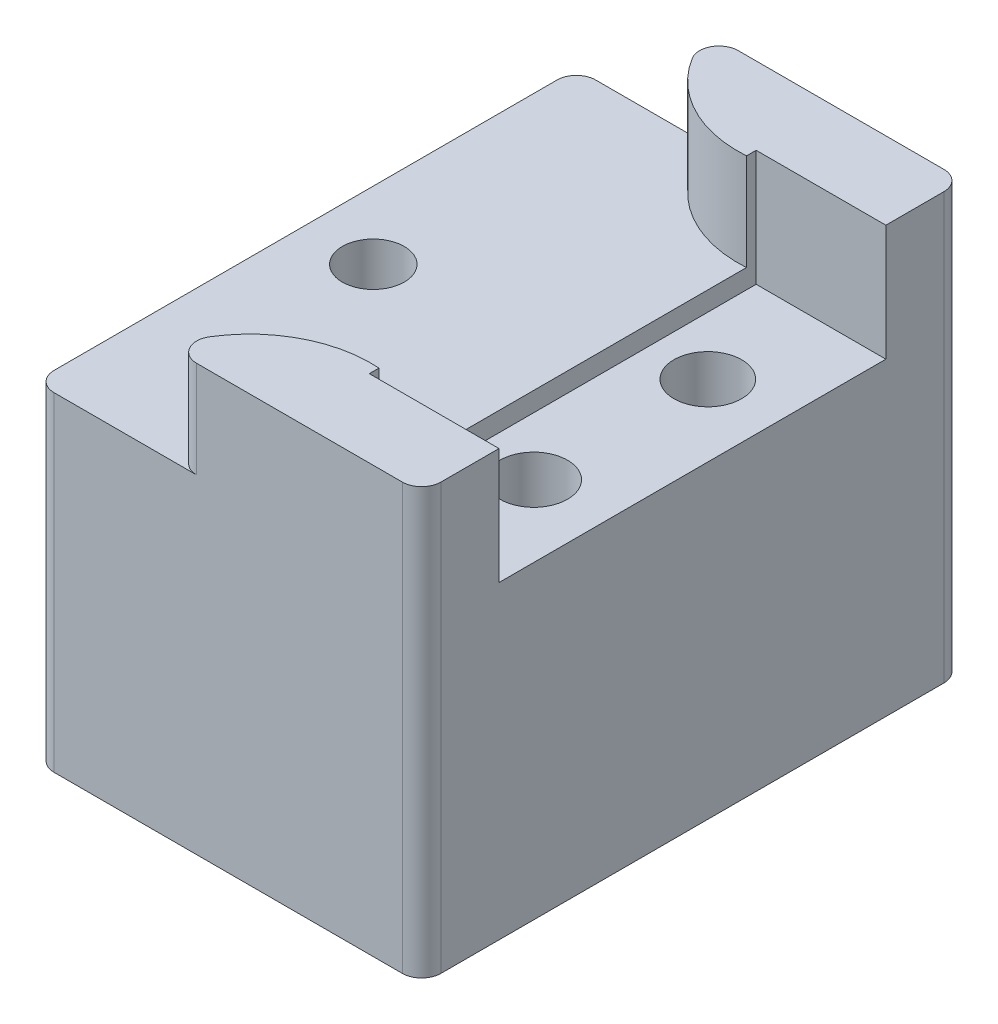
ISO-10303-21;
HEADER;
FILE_DESCRIPTION(('STEP AP214'),'2;1');
FILE_NAME('part.step','',(''),(''),'','','');
FILE_SCHEMA(('AUTOMOTIVE_DESIGN { 1 0 10303 214 1 1 1 1 }'));
ENDSEC;
DATA;
#1=APPLICATION_CONTEXT('core data for automotive mechanical design processes');
#2=APPLICATION_PROTOCOL_DEFINITION('international standard','automotive_design',2000,#1);
#3=PRODUCT_CONTEXT('',#1,'mechanical');
#4=PRODUCT('Part','Part','',(#3));
#5=PRODUCT_RELATED_PRODUCT_CATEGORY('part','',(#4));
#6=PRODUCT_DEFINITION_FORMATION('','',#4);
#7=PRODUCT_DEFINITION_CONTEXT('part definition',#1,'design');
#8=PRODUCT_DEFINITION('design','',#6,#7);
#9=PRODUCT_DEFINITION_SHAPE('','',#8);
#10=(LENGTH_UNIT() NAMED_UNIT(*) SI_UNIT(.MILLI.,.METRE.));
#11=(NAMED_UNIT(*) PLANE_ANGLE_UNIT() SI_UNIT($,.RADIAN.));
#12=(NAMED_UNIT(*) SI_UNIT($,.STERADIAN.) SOLID_ANGLE_UNIT());
#13=UNCERTAINTY_MEASURE_WITH_UNIT(LENGTH_MEASURE(1.E-05),#10,'distance_accuracy_value','');
#14=(GEOMETRIC_REPRESENTATION_CONTEXT(3) GLOBAL_UNCERTAINTY_ASSIGNED_CONTEXT((#13)) GLOBAL_UNIT_ASSIGNED_CONTEXT((#10,
#11,#12)) REPRESENTATION_CONTEXT('',''));
#15=CARTESIAN_POINT('',(0.,0.,0.));
#16=DIRECTION('',(0.,0.,1.));
#17=DIRECTION('',(1.,0.,0.));
#18=AXIS2_PLACEMENT_3D('',#15,#16,#17);
#19=CARTESIAN_POINT('',(-10.8433734939759,22.,-8.47389558232932));
#20=DIRECTION('',(1.,0.,0.));
#21=DIRECTION('',(0.,0.,-1.));
#22=AXIS2_PLACEMENT_3D('',#19,#20,#21);
#23=PLANE('',#22);
#24=DIRECTION('',(0.,0.,1.));
#25=VECTOR('',#24,1.);
#26=CARTESIAN_POINT('',(-10.8433734939759,17.,0.));
#27=LINE('',#26,#25);
#28=CARTESIAN_POINT('',(-10.8433734939759,17.,-7.47389558232932));
#29=VERTEX_POINT('',#28);
#30=CARTESIAN_POINT('',(-10.8433734939759,17.,18.5261044176707));
#31=VERTEX_POINT('',#30);
#32=EDGE_CURVE('E314',#29,#31,#27,.T.);
#33=ORIENTED_EDGE('',*,*,#32,.F.);
#34=DIRECTION('',(0.,-1.,0.));
#35=VECTOR('',#34,1.);
#36=CARTESIAN_POINT('',(-10.8433734939759,22.,-7.47389558232932));
#37=LINE('',#36,#35);
#38=CARTESIAN_POINT('',(-10.8433734939759,0.,-7.47389558232932));
#39=VERTEX_POINT('',#38);
#40=EDGE_CURVE('E284',#29,#39,#37,.T.);
#41=ORIENTED_EDGE('',*,*,#40,.T.);
#42=DIRECTION('',(0.,0.,1.));
#43=VECTOR('',#42,1.);
#44=CARTESIAN_POINT('',(-10.8433734939759,0.,-8.47389558232932));
#45=LINE('',#44,#43);
#46=CARTESIAN_POINT('',(-10.8433734939759,0.,18.5261044176707));
#47=VERTEX_POINT('',#46);
#48=EDGE_CURVE('E216',#39,#47,#45,.T.);
#49=ORIENTED_EDGE('',*,*,#48,.T.);
#50=DIRECTION('',(0.,-1.,0.));
#51=VECTOR('',#50,1.);
#52=CARTESIAN_POINT('',(-10.8433734939759,22.,18.5261044176707));
#53=LINE('',#52,#51);
#54=EDGE_CURVE('E48',#47,#31,#53,.F.);
#55=ORIENTED_EDGE('',*,*,#54,.T.);
#56=EDGE_LOOP('',(#33,#41,#49,#55));
#57=FACE_BOUND('',#56,.T.);
#58=ADVANCED_FACE('F33',(#57),#23,.F.);
#59=CARTESIAN_POINT('',(-10.8433734939759,22.,19.5261044176707));
#60=DIRECTION('',(0.,0.,-1.));
#61=DIRECTION('',(-1.,0.,0.));
#62=AXIS2_PLACEMENT_3D('',#59,#60,#61);
#63=PLANE('',#62);
#64=DIRECTION('',(1.,0.,0.));
#65=VECTOR('',#64,1.);
#66=CARTESIAN_POINT('',(-10.8433734939759,22.,19.5261044176707));
#67=LINE('',#66,#65);
#68=CARTESIAN_POINT('',(-2.47408756950972,22.,19.5261044176707));
#69=VERTEX_POINT('',#68);
#70=CARTESIAN_POINT('',(8.15662650602409,22.,19.5261044176707));
#71=VERTEX_POINT('',#70);
#72=EDGE_CURVE('E223',#69,#71,#67,.T.);
#73=ORIENTED_EDGE('',*,*,#72,.F.);
#74=DIRECTION('',(0.,-1.,0.));
#75=VECTOR('',#74,1.);
#76=CARTESIAN_POINT('',(-2.47408756950972,17.,19.5261044176707));
#77=LINE('',#76,#75);
#78=CARTESIAN_POINT('',(-2.47408756950972,17.,19.5261044176707));
#79=VERTEX_POINT('',#78);
#80=EDGE_CURVE('E267',#69,#79,#77,.T.);
#81=ORIENTED_EDGE('',*,*,#80,.T.);
#82=DIRECTION('',(1.,0.,0.));
#83=VECTOR('',#82,1.);
#84=CARTESIAN_POINT('',(0.,17.,19.5261044176707));
#85=LINE('',#84,#83);
#86=CARTESIAN_POINT('',(-9.8433734939759,17.,19.5261044176707));
#87=VERTEX_POINT('',#86);
#88=EDGE_CURVE('E190',#87,#79,#85,.T.);
#89=ORIENTED_EDGE('',*,*,#88,.F.);
#90=DIRECTION('',(0.,-1.,0.));
#91=VECTOR('',#90,1.);
#92=CARTESIAN_POINT('',(-9.8433734939759,22.,19.5261044176707));
#93=LINE('',#92,#91);
#94=CARTESIAN_POINT('',(-9.8433734939759,0.,19.5261044176707));
#95=VERTEX_POINT('',#94);
#96=EDGE_CURVE('E264',#87,#95,#93,.T.);
#97=ORIENTED_EDGE('',*,*,#96,.T.);
#98=DIRECTION('',(1.,0.,0.));
#99=VECTOR('',#98,1.);
#100=CARTESIAN_POINT('',(-10.8433734939759,0.,19.5261044176707));
#101=LINE('',#100,#99);
#102=CARTESIAN_POINT('',(8.15662650602409,0.,19.5261044176707));
#103=VERTEX_POINT('',#102);
#104=EDGE_CURVE('E235',#95,#103,#101,.T.);
#105=ORIENTED_EDGE('',*,*,#104,.T.);
#106=DIRECTION('',(0.,-1.,0.));
#107=VECTOR('',#106,1.);
#108=CARTESIAN_POINT('',(8.15662650602409,22.,19.5261044176707));
#109=LINE('',#108,#107);
#110=EDGE_CURVE('E262',#103,#71,#109,.F.);
#111=ORIENTED_EDGE('',*,*,#110,.T.);
#112=EDGE_LOOP('',(#73,#81,#89,#97,#105,#111));
#113=FACE_BOUND('',#112,.T.);
#114=ADVANCED_FACE('F345',(#113),#63,.F.);
#115=CARTESIAN_POINT('',(0.,22.,0.));
#116=DIRECTION('',(0.,1.,0.));
#117=DIRECTION('',(0.,0.,1.));
#118=AXIS2_PLACEMENT_3D('',#115,#116,#117);
#119=PLANE('',#118);
#120=CARTESIAN_POINT('',(2.02042580318858,22.,21.2850908464605));
#121=DIRECTION('',(0.,1.,0.));
#122=DIRECTION('',(0.,0.,1.));
#123=AXIS2_PLACEMENT_3D('',#120,#121,#122);
#124=CIRCLE('',#123,6.27377062182364);
#125=CARTESIAN_POINT('',(2.45087521889544,22.,15.0261044176707));
#126=VERTEX_POINT('',#125);
#127=CARTESIAN_POINT('',(-3.32632663999551,22.,18.0029518904499));
#128=VERTEX_POINT('',#127);
#129=EDGE_CURVE('E319',#126,#128,#124,.T.);
#130=ORIENTED_EDGE('',*,*,#129,.T.);
#131=CARTESIAN_POINT('',(-2.47408756950972,22.,18.5261044176707));
#132=DIRECTION('',(0.,1.,0.));
#133=DIRECTION('',(0.,0.,1.));
#134=AXIS2_PLACEMENT_3D('',#131,#132,#133);
#135=CIRCLE('',#134,1.);
#136=EDGE_CURVE('E260',#128,#69,#135,.T.);
#137=ORIENTED_EDGE('',*,*,#136,.T.);
#138=ORIENTED_EDGE('',*,*,#72,.T.);
#139=CARTESIAN_POINT('',(8.15662650602409,22.,18.5261044176707));
#140=DIRECTION('',(0.,1.,0.));
#141=DIRECTION('',(0.,0.,1.));
#142=AXIS2_PLACEMENT_3D('',#139,#140,#141);
#143=CIRCLE('',#142,1.);
#144=CARTESIAN_POINT('',(9.15662650602409,22.,18.5261044176707));
#145=VERTEX_POINT('',#144);
#146=EDGE_CURVE('E258',#71,#145,#143,.T.);
#147=ORIENTED_EDGE('',*,*,#146,.T.);
#148=DIRECTION('',(0.,0.,-1.));
#149=VECTOR('',#148,1.);
#150=CARTESIAN_POINT('',(9.15662650602409,22.,-8.47389558232932));
#151=LINE('',#150,#149);
#152=CARTESIAN_POINT('',(9.15662650602409,22.,15.5261044176707));
#153=VERTEX_POINT('',#152);
#154=EDGE_CURVE('E228',#145,#153,#151,.T.);
#155=ORIENTED_EDGE('',*,*,#154,.T.);
#156=DIRECTION('',(1.,0.,0.));
#157=VECTOR('',#156,1.);
#158=CARTESIAN_POINT('',(9.15662650602409,22.,15.5261044176707));
#159=LINE('',#158,#157);
#160=CARTESIAN_POINT('',(2.45087521889544,22.,15.5261044176707));
#161=VERTEX_POINT('',#160);
#162=EDGE_CURVE('E200',#161,#153,#159,.T.);
#163=ORIENTED_EDGE('',*,*,#162,.F.);
#164=DIRECTION('',(0.,0.,1.));
#165=VECTOR('',#164,1.);
#166=CARTESIAN_POINT('',(2.45087521889543,22.,-4.47389558232932));
#167=LINE('',#166,#165);
#168=EDGE_CURVE('E188',#126,#161,#167,.T.);
#169=ORIENTED_EDGE('',*,*,#168,.F.);
#170=EDGE_LOOP('',(#130,#137,#138,#147,#155,#163,#169));
#171=FACE_BOUND('',#170,.T.);
#172=ADVANCED_FACE('F342',(#171),#119,.T.);
#173=CARTESIAN_POINT('',(2.45087521889543,16.,-4.47389558232932));
#174=DIRECTION('',(-1.,0.,0.));
#175=DIRECTION('',(0.,0.,1.));
#176=AXIS2_PLACEMENT_3D('',#173,#174,#175);
#177=PLANE('',#176);
#178=DIRECTION('',(0.,1.,0.));
#179=VECTOR('',#178,1.);
#180=CARTESIAN_POINT('',(2.45087521889544,17.,15.0261044176707));
#181=LINE('',#180,#179);
#182=CARTESIAN_POINT('',(2.45087521889544,17.,15.0261044176707));
#183=VERTEX_POINT('',#182);
#184=EDGE_CURVE('E185',#183,#126,#181,.T.);
#185=ORIENTED_EDGE('',*,*,#184,.T.);
#186=ORIENTED_EDGE('',*,*,#168,.T.);
#187=DIRECTION('',(0.,1.,0.));
#188=VECTOR('',#187,1.);
#189=CARTESIAN_POINT('',(2.45087521889544,16.,15.5261044176707));
#190=LINE('',#189,#188);
#191=CARTESIAN_POINT('',(2.45087521889544,16.,15.5261044176707));
#192=VERTEX_POINT('',#191);
#193=EDGE_CURVE('E217',#192,#161,#190,.T.);
#194=ORIENTED_EDGE('',*,*,#193,.F.);
#195=DIRECTION('',(0.,0.,1.));
#196=VECTOR('',#195,1.);
#197=CARTESIAN_POINT('',(2.45087521889543,16.,-4.47389558232932));
#198=LINE('',#197,#196);
#199=CARTESIAN_POINT('',(2.45087521889543,16.,-4.47389558232932));
#200=VERTEX_POINT('',#199);
#201=EDGE_CURVE('E203',#200,#192,#198,.T.);
#202=ORIENTED_EDGE('',*,*,#201,.F.);
#203=DIRECTION('',(0.,1.,0.));
#204=VECTOR('',#203,1.);
#205=CARTESIAN_POINT('',(2.45087521889543,16.,-4.47389558232932));
#206=LINE('',#205,#204);
#207=CARTESIAN_POINT('',(2.45087521889543,22.,-4.47389558232932));
#208=VERTEX_POINT('',#207);
#209=EDGE_CURVE('E220',#200,#208,#206,.T.);
#210=ORIENTED_EDGE('',*,*,#209,.T.);
#211=CARTESIAN_POINT('',(2.45087521889543,22.,-3.97389558232932));
#212=VERTEX_POINT('',#211);
#213=EDGE_CURVE('E183',#208,#212,#167,.T.);
#214=ORIENTED_EDGE('',*,*,#213,.T.);
#215=DIRECTION('',(0.,1.,0.));
#216=VECTOR('',#215,1.);
#217=CARTESIAN_POINT('',(2.45087521889543,17.,-3.97389558232932));
#218=LINE('',#217,#216);
#219=CARTESIAN_POINT('',(2.45087521889543,17.,-3.97389558232932));
#220=VERTEX_POINT('',#219);
#221=EDGE_CURVE('E163',#220,#212,#218,.T.);
#222=ORIENTED_EDGE('',*,*,#221,.F.);
#223=DIRECTION('',(0.,0.,-1.));
#224=VECTOR('',#223,1.);
#225=CARTESIAN_POINT('',(2.45087521889543,17.,0.));
#226=LINE('',#225,#224);
#227=EDGE_CURVE('E170',#183,#220,#226,.T.);
#228=ORIENTED_EDGE('',*,*,#227,.F.);
#229=EDGE_LOOP('',(#185,#186,#194,#202,#210,#214,#222,#228));
#230=FACE_BOUND('',#229,.T.);
#231=ADVANCED_FACE('F181',(#230),#177,.F.);
#232=CARTESIAN_POINT('',(9.15662650602409,22.,-8.47389558232932));
#233=DIRECTION('',(-1.,0.,0.));
#234=DIRECTION('',(0.,0.,1.));
#235=AXIS2_PLACEMENT_3D('',#232,#233,#234);
#236=PLANE('',#235);
#237=DIRECTION('',(0.,0.,-1.));
#238=VECTOR('',#237,1.);
#239=CARTESIAN_POINT('',(9.15662650602409,0.,-8.47389558232932));
#240=LINE('',#239,#238);
#241=CARTESIAN_POINT('',(9.15662650602409,0.,18.5261044176707));
#242=VERTEX_POINT('',#241);
#243=CARTESIAN_POINT('',(9.15662650602409,0.,-7.47389558232932));
#244=VERTEX_POINT('',#243);
#245=EDGE_CURVE('E238',#242,#244,#240,.T.);
#246=ORIENTED_EDGE('',*,*,#245,.T.);
#247=DIRECTION('',(0.,-1.,0.));
#248=VECTOR('',#247,1.);
#249=CARTESIAN_POINT('',(9.15662650602409,22.,-7.47389558232932));
#250=LINE('',#249,#248);
#251=CARTESIAN_POINT('',(9.15662650602409,22.,-7.47389558232932));
#252=VERTEX_POINT('',#251);
#253=EDGE_CURVE('E281',#244,#252,#250,.F.);
#254=ORIENTED_EDGE('',*,*,#253,.T.);
#255=CARTESIAN_POINT('',(9.15662650602409,22.,-4.47389558232932));
#256=VERTEX_POINT('',#255);
#257=EDGE_CURVE('E226',#256,#252,#151,.T.);
#258=ORIENTED_EDGE('',*,*,#257,.F.);
#259=DIRECTION('',(0.,1.,0.));
#260=VECTOR('',#259,1.);
#261=CARTESIAN_POINT('',(9.15662650602409,16.,-4.47389558232932));
#262=LINE('',#261,#260);
#263=CARTESIAN_POINT('',(9.15662650602409,16.,-4.47389558232932));
#264=VERTEX_POINT('',#263);
#265=EDGE_CURVE('E208',#264,#256,#262,.T.);
#266=ORIENTED_EDGE('',*,*,#265,.F.);
#267=DIRECTION('',(0.,0.,-1.));
#268=VECTOR('',#267,1.);
#269=CARTESIAN_POINT('',(9.15662650602409,16.,-4.47389558232932));
#270=LINE('',#269,#268);
#271=CARTESIAN_POINT('',(9.15662650602409,16.,15.5261044176707));
#272=VERTEX_POINT('',#271);
#273=EDGE_CURVE('E196',#272,#264,#270,.T.);
#274=ORIENTED_EDGE('',*,*,#273,.F.);
#275=DIRECTION('',(0.,1.,0.));
#276=VECTOR('',#275,1.);
#277=CARTESIAN_POINT('',(9.15662650602409,16.,15.5261044176707));
#278=LINE('',#277,#276);
#279=EDGE_CURVE('E213',#272,#153,#278,.T.);
#280=ORIENTED_EDGE('',*,*,#279,.T.);
#281=ORIENTED_EDGE('',*,*,#154,.F.);
#282=DIRECTION('',(0.,-1.,0.));
#283=VECTOR('',#282,1.);
#284=CARTESIAN_POINT('',(9.15662650602409,22.,18.5261044176707));
#285=LINE('',#284,#283);
#286=EDGE_CURVE('E278',#145,#242,#285,.T.);
#287=ORIENTED_EDGE('',*,*,#286,.T.);
#288=EDGE_LOOP('',(#246,#254,#258,#266,#274,#280,#281,#287));
#289=FACE_BOUND('',#288,.T.);
#290=ADVANCED_FACE('F354',(#289),#236,.F.);
#291=CARTESIAN_POINT('',(-10.8433734939759,22.,-8.47389558232932));
#292=DIRECTION('',(0.,0.,1.));
#293=DIRECTION('',(1.,0.,0.));
#294=AXIS2_PLACEMENT_3D('',#291,#292,#293);
#295=PLANE('',#294);
#296=DIRECTION('',(-1.,0.,0.));
#297=VECTOR('',#296,1.);
#298=CARTESIAN_POINT('',(0.,17.,-8.47389558232932));
#299=LINE('',#298,#297);
#300=CARTESIAN_POINT('',(-2.47408756950971,17.,-8.47389558232932));
#301=VERTEX_POINT('',#300);
#302=CARTESIAN_POINT('',(-9.84337349397591,17.,-8.47389558232932));
#303=VERTEX_POINT('',#302);
#304=EDGE_CURVE('E169',#301,#303,#299,.T.);
#305=ORIENTED_EDGE('',*,*,#304,.F.);
#306=DIRECTION('',(0.,1.,0.));
#307=VECTOR('',#306,1.);
#308=CARTESIAN_POINT('',(-2.47408756950971,22.,-8.47389558232932));
#309=LINE('',#308,#307);
#310=CARTESIAN_POINT('',(-2.47408756950971,22.,-8.47389558232932));
#311=VERTEX_POINT('',#310);
#312=EDGE_CURVE('E247',#301,#311,#309,.T.);
#313=ORIENTED_EDGE('',*,*,#312,.T.);
#314=DIRECTION('',(-1.,0.,0.));
#315=VECTOR('',#314,1.);
#316=CARTESIAN_POINT('',(-10.8433734939759,22.,-8.47389558232932));
#317=LINE('',#316,#315);
#318=CARTESIAN_POINT('',(8.15662650602409,22.,-8.47389558232932));
#319=VERTEX_POINT('',#318);
#320=EDGE_CURVE('E230',#319,#311,#317,.T.);
#321=ORIENTED_EDGE('',*,*,#320,.F.);
#322=DIRECTION('',(0.,-1.,0.));
#323=VECTOR('',#322,1.);
#324=CARTESIAN_POINT('',(8.15662650602409,22.,-8.47389558232932));
#325=LINE('',#324,#323);
#326=CARTESIAN_POINT('',(8.15662650602409,0.,-8.47389558232932));
#327=VERTEX_POINT('',#326);
#328=EDGE_CURVE('E244',#319,#327,#325,.T.);
#329=ORIENTED_EDGE('',*,*,#328,.T.);
#330=DIRECTION('',(-1.,0.,0.));
#331=VECTOR('',#330,1.);
#332=CARTESIAN_POINT('',(-10.8433734939759,0.,-8.47389558232932));
#333=LINE('',#332,#331);
#334=CARTESIAN_POINT('',(-9.84337349397591,0.,-8.47389558232932));
#335=VERTEX_POINT('',#334);
#336=EDGE_CURVE('E227',#327,#335,#333,.T.);
#337=ORIENTED_EDGE('',*,*,#336,.T.);
#338=DIRECTION('',(0.,-1.,0.));
#339=VECTOR('',#338,1.);
#340=CARTESIAN_POINT('',(-9.84337349397591,22.,-8.47389558232932));
#341=LINE('',#340,#339);
#342=EDGE_CURVE('E233',#335,#303,#341,.F.);
#343=ORIENTED_EDGE('',*,*,#342,.T.);
#344=EDGE_LOOP('',(#305,#313,#321,#329,#337,#343));
#345=FACE_BOUND('',#344,.T.);
#346=ADVANCED_FACE('F294',(#345),#295,.F.);
#347=ORIENTED_EDGE('',*,*,#320,.T.);
#348=CARTESIAN_POINT('',(-2.47408756950971,22.,-7.47389558232932));
#349=DIRECTION('',(0.,1.,0.));
#350=DIRECTION('',(0.,0.,1.));
#351=AXIS2_PLACEMENT_3D('',#348,#349,#350);
#352=CIRCLE('',#351,1.);
#353=CARTESIAN_POINT('',(-3.32632663999551,22.,-6.95074305510852));
#354=VERTEX_POINT('',#353);
#355=EDGE_CURVE('E252',#311,#354,#352,.T.);
#356=ORIENTED_EDGE('',*,*,#355,.T.);
#357=CARTESIAN_POINT('',(2.02042580318858,22.,-10.2328820111191));
#358=DIRECTION('',(0.,1.,0.));
#359=DIRECTION('',(0.,0.,1.));
#360=AXIS2_PLACEMENT_3D('',#357,#358,#359);
#361=CIRCLE('',#360,6.27377062182364);
#362=EDGE_CURVE('E193',#212,#354,#361,.F.);
#363=ORIENTED_EDGE('',*,*,#362,.F.);
#364=ORIENTED_EDGE('',*,*,#213,.F.);
#365=DIRECTION('',(-1.,0.,0.));
#366=VECTOR('',#365,1.);
#367=CARTESIAN_POINT('',(9.15662650602409,22.,-4.47389558232932));
#368=LINE('',#367,#366);
#369=EDGE_CURVE('E184',#256,#208,#368,.T.);
#370=ORIENTED_EDGE('',*,*,#369,.F.);
#371=ORIENTED_EDGE('',*,*,#257,.T.);
#372=CARTESIAN_POINT('',(8.15662650602409,22.,-7.47389558232932));
#373=DIRECTION('',(0.,1.,0.));
#374=DIRECTION('',(0.,0.,1.));
#375=AXIS2_PLACEMENT_3D('',#372,#373,#374);
#376=CIRCLE('',#375,1.);
#377=EDGE_CURVE('E250',#252,#319,#376,.T.);
#378=ORIENTED_EDGE('',*,*,#377,.T.);
#379=EDGE_LOOP('',(#347,#356,#363,#364,#370,#371,#378));
#380=FACE_BOUND('',#379,.T.);
#381=ADVANCED_FACE('F297',(#380),#119,.T.);
#382=CARTESIAN_POINT('',(0.,0.,0.));
#383=DIRECTION('',(0.,1.,0.));
#384=DIRECTION('',(0.,0.,1.));
#385=AXIS2_PLACEMENT_3D('',#382,#383,#384);
#386=PLANE('',#385);
#387=CARTESIAN_POINT('',(5.45087521889543,0.,10.0261044176707));
#388=DIRECTION('',(0.,1.,0.));
#389=DIRECTION('',(0.,0.,1.));
#390=AXIS2_PLACEMENT_3D('',#387,#388,#389);
#391=CIRCLE('',#390,1.75);
#392=CARTESIAN_POINT('',(5.45087521889543,0.,11.7761044176707));
#393=VERTEX_POINT('',#392);
#394=EDGE_CURVE('E563',#393,#393,#391,.T.);
#395=ORIENTED_EDGE('',*,*,#394,.T.);
#396=EDGE_LOOP('',(#395));
#397=FACE_BOUND('',#396,.T.);
#398=CARTESIAN_POINT('',(5.45087521889543,0.,1.02610441767068));
#399=DIRECTION('',(0.,1.,0.));
#400=DIRECTION('',(0.,0.,1.));
#401=AXIS2_PLACEMENT_3D('',#398,#399,#400);
#402=CIRCLE('',#401,1.75);
#403=CARTESIAN_POINT('',(5.45087521889543,0.,2.77610441767068));
#404=VERTEX_POINT('',#403);
#405=EDGE_CURVE('E330',#404,#404,#402,.T.);
#406=ORIENTED_EDGE('',*,*,#405,.T.);
#407=EDGE_LOOP('',(#406));
#408=FACE_BOUND('',#407,.T.);
#409=CARTESIAN_POINT('',(-7.34337349397591,0.,5.52610441767068));
#410=DIRECTION('',(0.,1.,0.));
#411=DIRECTION('',(0.,0.,1.));
#412=AXIS2_PLACEMENT_3D('',#409,#410,#411);
#413=CIRCLE('',#412,1.6);
#414=CARTESIAN_POINT('',(-7.34337349397591,0.,7.12610441767068));
#415=VERTEX_POINT('',#414);
#416=EDGE_CURVE('E321',#415,#415,#413,.T.);
#417=ORIENTED_EDGE('',*,*,#416,.T.);
#418=EDGE_LOOP('',(#417));
#419=FACE_BOUND('',#418,.T.);
#420=ORIENTED_EDGE('',*,*,#336,.F.);
#421=CARTESIAN_POINT('',(8.15662650602409,0.,-7.47389558232932));
#422=DIRECTION('',(0.,1.,0.));
#423=DIRECTION('',(0.,0.,1.));
#424=AXIS2_PLACEMENT_3D('',#421,#422,#423);
#425=CIRCLE('',#424,1.);
#426=EDGE_CURVE('E276',#327,#244,#425,.F.);
#427=ORIENTED_EDGE('',*,*,#426,.T.);
#428=ORIENTED_EDGE('',*,*,#245,.F.);
#429=CARTESIAN_POINT('',(8.15662650602409,0.,18.5261044176707));
#430=DIRECTION('',(0.,1.,0.));
#431=DIRECTION('',(0.,0.,1.));
#432=AXIS2_PLACEMENT_3D('',#429,#430,#431);
#433=CIRCLE('',#432,1.);
#434=EDGE_CURVE('E270',#242,#103,#433,.F.);
#435=ORIENTED_EDGE('',*,*,#434,.T.);
#436=ORIENTED_EDGE('',*,*,#104,.F.);
#437=CARTESIAN_POINT('',(-9.8433734939759,0.,18.5261044176707));
#438=DIRECTION('',(0.,1.,0.));
#439=DIRECTION('',(0.,0.,1.));
#440=AXIS2_PLACEMENT_3D('',#437,#438,#439);
#441=CIRCLE('',#440,1.);
#442=EDGE_CURVE('E272',#95,#47,#441,.F.);
#443=ORIENTED_EDGE('',*,*,#442,.T.);
#444=ORIENTED_EDGE('',*,*,#48,.F.);
#445=CARTESIAN_POINT('',(-9.84337349397591,0.,-7.47389558232932));
#446=DIRECTION('',(0.,1.,0.));
#447=DIRECTION('',(0.,0.,1.));
#448=AXIS2_PLACEMENT_3D('',#445,#446,#447);
#449=CIRCLE('',#448,1.);
#450=EDGE_CURVE('E274',#39,#335,#449,.F.);
#451=ORIENTED_EDGE('',*,*,#450,.T.);
#452=EDGE_LOOP('',(#420,#427,#428,#435,#436,#443,#444,#451));
#453=FACE_BOUND('',#452,.T.);
#454=ADVANCED_FACE('F308',(#397,#408,#419,#453),#386,.F.);
#455=CARTESIAN_POINT('',(9.15662650602409,16.,15.5261044176707));
#456=DIRECTION('',(0.,0.,1.));
#457=DIRECTION('',(1.,0.,0.));
#458=AXIS2_PLACEMENT_3D('',#455,#456,#457);
#459=PLANE('',#458);
#460=ORIENTED_EDGE('',*,*,#162,.T.);
#461=ORIENTED_EDGE('',*,*,#279,.F.);
#462=DIRECTION('',(1.,0.,0.));
#463=VECTOR('',#462,1.);
#464=CARTESIAN_POINT('',(9.15662650602409,16.,15.5261044176707));
#465=LINE('',#464,#463);
#466=EDGE_CURVE('E206',#192,#272,#465,.T.);
#467=ORIENTED_EDGE('',*,*,#466,.F.);
#468=ORIENTED_EDGE('',*,*,#193,.T.);
#469=EDGE_LOOP('',(#460,#461,#467,#468));
#470=FACE_BOUND('',#469,.T.);
#471=ADVANCED_FACE('F359',(#470),#459,.F.);
#472=CARTESIAN_POINT('',(9.15662650602409,16.,-4.47389558232932));
#473=DIRECTION('',(0.,0.,-1.));
#474=DIRECTION('',(-1.,0.,0.));
#475=AXIS2_PLACEMENT_3D('',#472,#473,#474);
#476=PLANE('',#475);
#477=ORIENTED_EDGE('',*,*,#369,.T.);
#478=ORIENTED_EDGE('',*,*,#209,.F.);
#479=DIRECTION('',(-1.,0.,0.));
#480=VECTOR('',#479,1.);
#481=CARTESIAN_POINT('',(9.15662650602409,16.,-4.47389558232932));
#482=LINE('',#481,#480);
#483=EDGE_CURVE('E199',#264,#200,#482,.T.);
#484=ORIENTED_EDGE('',*,*,#483,.F.);
#485=ORIENTED_EDGE('',*,*,#265,.T.);
#486=EDGE_LOOP('',(#477,#478,#484,#485));
#487=FACE_BOUND('',#486,.T.);
#488=ADVANCED_FACE('F364',(#487),#476,.F.);
#489=CARTESIAN_POINT('',(0.,16.,0.));
#490=DIRECTION('',(0.,-1.,0.));
#491=DIRECTION('',(0.,0.,-1.));
#492=AXIS2_PLACEMENT_3D('',#489,#490,#491);
#493=PLANE('',#492);
#494=CARTESIAN_POINT('',(5.45087521889543,16.,10.0261044176707));
#495=DIRECTION('',(0.,1.,0.));
#496=DIRECTION('',(0.,0.,1.));
#497=AXIS2_PLACEMENT_3D('',#494,#495,#496);
#498=CIRCLE('',#497,1.75);
#499=CARTESIAN_POINT('',(5.45087521889543,16.,11.7761044176707));
#500=VERTEX_POINT('',#499);
#501=EDGE_CURVE('E566',#500,#500,#498,.T.);
#502=ORIENTED_EDGE('',*,*,#501,.F.);
#503=EDGE_LOOP('',(#502));
#504=FACE_BOUND('',#503,.T.);
#505=CARTESIAN_POINT('',(5.45087521889543,16.,1.02610441767068));
#506=DIRECTION('',(0.,1.,0.));
#507=DIRECTION('',(0.,0.,1.));
#508=AXIS2_PLACEMENT_3D('',#505,#506,#507);
#509=CIRCLE('',#508,1.75);
#510=CARTESIAN_POINT('',(5.45087521889543,16.,2.77610441767068));
#511=VERTEX_POINT('',#510);
#512=EDGE_CURVE('E568',#511,#511,#509,.T.);
#513=ORIENTED_EDGE('',*,*,#512,.F.);
#514=EDGE_LOOP('',(#513));
#515=FACE_BOUND('',#514,.T.);
#516=ORIENTED_EDGE('',*,*,#273,.T.);
#517=ORIENTED_EDGE('',*,*,#483,.T.);
#518=ORIENTED_EDGE('',*,*,#201,.T.);
#519=ORIENTED_EDGE('',*,*,#466,.T.);
#520=EDGE_LOOP('',(#516,#517,#518,#519));
#521=FACE_BOUND('',#520,.T.);
#522=ADVANCED_FACE('F361',(#504,#515,#521),#493,.F.);
#523=CARTESIAN_POINT('',(2.02042580318858,17.,21.2850908464605));
#524=DIRECTION('',(0.,1.,0.));
#525=DIRECTION('',(0.,0.,1.));
#526=AXIS2_PLACEMENT_3D('',#523,#524,#525);
#527=CYLINDRICAL_SURFACE('',#526,6.27377062182364);
#528=CARTESIAN_POINT('',(2.02042580318858,17.,21.2850908464605));
#529=DIRECTION('',(0.,1.,0.));
#530=DIRECTION('',(0.,0.,1.));
#531=AXIS2_PLACEMENT_3D('',#528,#529,#530);
#532=CIRCLE('',#531,6.27377062182364);
#533=CARTESIAN_POINT('',(-3.32632663999551,17.,18.0029518904499));
#534=VERTEX_POINT('',#533);
#535=EDGE_CURVE('E175',#183,#534,#532,.T.);
#536=ORIENTED_EDGE('',*,*,#535,.T.);
#537=DIRECTION('',(0.,1.,0.));
#538=VECTOR('',#537,1.);
#539=CARTESIAN_POINT('',(-3.32632663999551,17.,18.0029518904499));
#540=LINE('',#539,#538);
#541=EDGE_CURVE('E255',#534,#128,#540,.T.);
#542=ORIENTED_EDGE('',*,*,#541,.T.);
#543=ORIENTED_EDGE('',*,*,#129,.F.);
#544=ORIENTED_EDGE('',*,*,#184,.F.);
#545=EDGE_LOOP('',(#536,#542,#543,#544));
#546=FACE_BOUND('',#545,.T.);
#547=ADVANCED_FACE('F336',(#546),#527,.T.);
#548=CARTESIAN_POINT('',(2.02042580318858,17.,-10.2328820111191));
#549=DIRECTION('',(0.,1.,0.));
#550=DIRECTION('',(0.,0.,1.));
#551=AXIS2_PLACEMENT_3D('',#548,#549,#550);
#552=CYLINDRICAL_SURFACE('',#551,6.27377062182364);
#553=ORIENTED_EDGE('',*,*,#362,.T.);
#554=DIRECTION('',(0.,1.,0.));
#555=VECTOR('',#554,1.);
#556=CARTESIAN_POINT('',(-3.32632663999551,17.,-6.95074305510852));
#557=LINE('',#556,#555);
#558=CARTESIAN_POINT('',(-3.32632663999551,17.,-6.95074305510852));
#559=VERTEX_POINT('',#558);
#560=EDGE_CURVE('E166',#354,#559,#557,.F.);
#561=ORIENTED_EDGE('',*,*,#560,.T.);
#562=CARTESIAN_POINT('',(2.02042580318858,17.,-10.2328820111191));
#563=DIRECTION('',(0.,1.,0.));
#564=DIRECTION('',(0.,0.,1.));
#565=AXIS2_PLACEMENT_3D('',#562,#563,#564);
#566=CIRCLE('',#565,6.27377062182364);
#567=EDGE_CURVE('E158',#220,#559,#566,.F.);
#568=ORIENTED_EDGE('',*,*,#567,.F.);
#569=ORIENTED_EDGE('',*,*,#221,.T.);
#570=EDGE_LOOP('',(#553,#561,#568,#569));
#571=FACE_BOUND('',#570,.T.);
#572=ADVANCED_FACE('F161',(#571),#552,.T.);
#573=CARTESIAN_POINT('',(0.,17.,0.));
#574=DIRECTION('',(0.,1.,0.));
#575=DIRECTION('',(0.,0.,1.));
#576=AXIS2_PLACEMENT_3D('',#573,#574,#575);
#577=PLANE('',#576);
#578=CARTESIAN_POINT('',(-7.34337349397591,17.,5.52610441767068));
#579=DIRECTION('',(0.,1.,0.));
#580=DIRECTION('',(0.,0.,1.));
#581=AXIS2_PLACEMENT_3D('',#578,#579,#580);
#582=CIRCLE('',#581,1.6);
#583=CARTESIAN_POINT('',(-7.34337349397591,17.,7.12610441767068));
#584=VERTEX_POINT('',#583);
#585=EDGE_CURVE('E325',#584,#584,#582,.T.);
#586=ORIENTED_EDGE('',*,*,#585,.F.);
#587=EDGE_LOOP('',(#586));
#588=FACE_BOUND('',#587,.T.);
#589=ORIENTED_EDGE('',*,*,#304,.T.);
#590=CARTESIAN_POINT('',(-9.84337349397591,17.,-7.47389558232932));
#591=DIRECTION('',(0.,1.,0.));
#592=DIRECTION('',(0.,0.,1.));
#593=AXIS2_PLACEMENT_3D('',#590,#591,#592);
#594=CIRCLE('',#593,1.);
#595=EDGE_CURVE('E55',#303,#29,#594,.T.);
#596=ORIENTED_EDGE('',*,*,#595,.T.);
#597=ORIENTED_EDGE('',*,*,#32,.T.);
#598=CARTESIAN_POINT('',(-9.8433734939759,17.,18.5261044176707));
#599=DIRECTION('',(0.,1.,0.));
#600=DIRECTION('',(0.,0.,1.));
#601=AXIS2_PLACEMENT_3D('',#598,#599,#600);
#602=CIRCLE('',#601,1.);
#603=EDGE_CURVE('E287',#31,#87,#602,.T.);
#604=ORIENTED_EDGE('',*,*,#603,.T.);
#605=ORIENTED_EDGE('',*,*,#88,.T.);
#606=CARTESIAN_POINT('',(-2.47408756950972,17.,18.5261044176707));
#607=DIRECTION('',(0.,1.,0.));
#608=DIRECTION('',(0.,0.,1.));
#609=AXIS2_PLACEMENT_3D('',#606,#607,#608);
#610=CIRCLE('',#609,1.);
#611=EDGE_CURVE('E11',#79,#534,#610,.F.);
#612=ORIENTED_EDGE('',*,*,#611,.T.);
#613=ORIENTED_EDGE('',*,*,#535,.F.);
#614=ORIENTED_EDGE('',*,*,#227,.T.);
#615=ORIENTED_EDGE('',*,*,#567,.T.);
#616=CARTESIAN_POINT('',(-2.47408756950971,17.,-7.47389558232932));
#617=DIRECTION('',(0.,1.,0.));
#618=DIRECTION('',(0.,0.,1.));
#619=AXIS2_PLACEMENT_3D('',#616,#617,#618);
#620=CIRCLE('',#619,1.);
#621=EDGE_CURVE('E41',#559,#301,#620,.F.);
#622=ORIENTED_EDGE('',*,*,#621,.T.);
#623=EDGE_LOOP('',(#589,#596,#597,#604,#605,#612,#613,#614,#615,#622));
#624=FACE_BOUND('',#623,.T.);
#625=ADVANCED_FACE('F173',(#588,#624),#577,.T.);
#626=CARTESIAN_POINT('',(-7.34337349397591,-6.67840441925287,5.52610441767068));
#627=DIRECTION('',(0.,1.,0.));
#628=DIRECTION('',(0.,0.,1.));
#629=AXIS2_PLACEMENT_3D('',#626,#627,#628);
#630=CYLINDRICAL_SURFACE('',#629,1.6);
#631=CARTESIAN_POINT('',(-7.34337349397591,17.,7.12610441767068));
#632=CARTESIAN_POINT('',(-7.34337349397591,16.8229166666667,7.12610441767068));
#633=CARTESIAN_POINT('',(-7.34337349397591,16.6458333333333,7.12610441767068));
#634=CARTESIAN_POINT('',(-7.34337349397591,16.2916666666667,7.12610441767068));
#635=CARTESIAN_POINT('',(-7.34337349397591,16.1145833333333,7.12610441767068));
#636=CARTESIAN_POINT('',(-7.34337349397591,15.7604166666667,7.12610441767068));
#637=CARTESIAN_POINT('',(-7.34337349397591,15.5833333333333,7.12610441767068));
#638=CARTESIAN_POINT('',(-7.34337349397591,15.2291666666667,7.12610441767068));
#639=CARTESIAN_POINT('',(-7.34337349397591,15.0520833333333,7.12610441767068));
#640=CARTESIAN_POINT('',(-7.34337349397591,14.6979166666667,7.12610441767068));
#641=CARTESIAN_POINT('',(-7.34337349397591,14.5208333333333,7.12610441767068));
#642=CARTESIAN_POINT('',(-7.34337349397591,14.1666666666667,7.12610441767068));
#643=CARTESIAN_POINT('',(-7.34337349397591,13.9895833333333,7.12610441767068));
#644=CARTESIAN_POINT('',(-7.34337349397591,13.6354166666667,7.12610441767068));
#645=CARTESIAN_POINT('',(-7.34337349397591,13.4583333333333,7.12610441767068));
#646=CARTESIAN_POINT('',(-7.34337349397591,13.1041666666667,7.12610441767068));
#647=CARTESIAN_POINT('',(-7.34337349397591,12.9270833333333,7.12610441767068));
#648=CARTESIAN_POINT('',(-7.34337349397591,12.5729166666667,7.12610441767068));
#649=CARTESIAN_POINT('',(-7.34337349397591,12.3958333333333,7.12610441767068));
#650=CARTESIAN_POINT('',(-7.34337349397591,12.0416666666667,7.12610441767068));
#651=CARTESIAN_POINT('',(-7.34337349397591,11.8645833333333,7.12610441767068));
#652=CARTESIAN_POINT('',(-7.34337349397591,11.5104166666667,7.12610441767068));
#653=CARTESIAN_POINT('',(-7.34337349397591,11.3333333333333,7.12610441767068));
#654=CARTESIAN_POINT('',(-7.34337349397591,10.9791666666667,7.12610441767068));
#655=CARTESIAN_POINT('',(-7.34337349397591,10.8020833333333,7.12610441767068));
#656=CARTESIAN_POINT('',(-7.34337349397591,10.4479166666667,7.12610441767068));
#657=CARTESIAN_POINT('',(-7.34337349397591,10.2708333333333,7.12610441767068));
#658=CARTESIAN_POINT('',(-7.34337349397591,9.91666666666666,7.12610441767068));
#659=CARTESIAN_POINT('',(-7.34337349397591,9.73958333333333,7.12610441767068));
#660=CARTESIAN_POINT('',(-7.34337349397591,9.38541666666666,7.12610441767068));
#661=CARTESIAN_POINT('',(-7.34337349397591,9.20833333333333,7.12610441767068));
#662=CARTESIAN_POINT('',(-7.34337349397591,8.85416666666666,7.12610441767068));
#663=CARTESIAN_POINT('',(-7.34337349397591,8.67708333333333,7.12610441767068));
#664=CARTESIAN_POINT('',(-7.34337349397591,8.32291666666666,7.12610441767068));
#665=CARTESIAN_POINT('',(-7.34337349397591,8.14583333333333,7.12610441767068));
#666=CARTESIAN_POINT('',(-7.34337349397591,7.79166666666666,7.12610441767068));
#667=CARTESIAN_POINT('',(-7.34337349397591,7.61458333333333,7.12610441767068));
#668=CARTESIAN_POINT('',(-7.34337349397591,7.26041666666666,7.12610441767068));
#669=CARTESIAN_POINT('',(-7.34337349397591,7.08333333333333,7.12610441767068));
#670=CARTESIAN_POINT('',(-7.34337349397591,6.72916666666666,7.12610441767068));
#671=CARTESIAN_POINT('',(-7.34337349397591,6.55208333333333,7.12610441767068));
#672=CARTESIAN_POINT('',(-7.34337349397591,6.19791666666666,7.12610441767068));
#673=CARTESIAN_POINT('',(-7.34337349397591,6.02083333333333,7.12610441767068));
#674=CARTESIAN_POINT('',(-7.34337349397591,5.66666666666666,7.12610441767068));
#675=CARTESIAN_POINT('',(-7.34337349397591,5.48958333333333,7.12610441767068));
#676=CARTESIAN_POINT('',(-7.34337349397591,5.13541666666666,7.12610441767068));
#677=CARTESIAN_POINT('',(-7.34337349397591,4.95833333333333,7.12610441767068));
#678=CARTESIAN_POINT('',(-7.34337349397591,4.60416666666666,7.12610441767068));
#679=CARTESIAN_POINT('',(-7.34337349397591,4.42708333333333,7.12610441767068));
#680=CARTESIAN_POINT('',(-7.34337349397591,4.07291666666667,7.12610441767068));
#681=CARTESIAN_POINT('',(-7.34337349397591,3.89583333333333,7.12610441767068));
#682=CARTESIAN_POINT('',(-7.34337349397591,3.54166666666666,7.12610441767068));
#683=CARTESIAN_POINT('',(-7.34337349397591,3.36458333333333,7.12610441767068));
#684=CARTESIAN_POINT('',(-7.34337349397591,3.01041666666666,7.12610441767068));
#685=CARTESIAN_POINT('',(-7.34337349397591,2.83333333333333,7.12610441767068));
#686=CARTESIAN_POINT('',(-7.34337349397591,2.47916666666666,7.12610441767068));
#687=CARTESIAN_POINT('',(-7.34337349397591,2.30208333333333,7.12610441767068));
#688=CARTESIAN_POINT('',(-7.34337349397591,1.94791666666666,7.12610441767068));
#689=CARTESIAN_POINT('',(-7.34337349397591,1.77083333333333,7.12610441767068));
#690=CARTESIAN_POINT('',(-7.34337349397591,1.41666666666667,7.12610441767068));
#691=CARTESIAN_POINT('',(-7.34337349397591,1.23958333333333,7.12610441767068));
#692=CARTESIAN_POINT('',(-7.34337349397591,0.885416666666667,7.12610441767068));
#693=CARTESIAN_POINT('',(-7.34337349397591,0.708333333333333,7.12610441767068));
#694=CARTESIAN_POINT('',(-7.34337349397591,0.354166666666666,7.12610441767068));
#695=CARTESIAN_POINT('',(-7.34337349397591,0.177083333333332,7.12610441767068));
#696=CARTESIAN_POINT('',(-7.34337349397591,0.,7.12610441767068));
#697=B_SPLINE_CURVE_WITH_KNOTS('',3,(#631,#632,#633,#634,#635,#636,#637,#638,#639,#640,#641,
#642,#643,#644,#645,#646,#647,#648,#649,#650,#651,#652,#653,#654,#655,#656,#657,#658,#659,#660,
#661,#662,#663,#664,#665,#666,#667,#668,#669,#670,#671,#672,#673,#674,#675,#676,#677,#678,#679,
#680,#681,#682,#683,#684,#685,#686,#687,#688,#689,#690,#691,#692,#693,#694,#695,#696),
.UNSPECIFIED.,.F.,.F.,(4,2,2,2,2,2,2,2,2,2,2,2,2,2,2,2,2,2,2,2,2,2,2,2,2,2,2,2,2,2,2,2,4),(0.,
0.53125,1.0625,1.59375,2.125,2.65625,3.1875,3.71875,4.25,4.78125,5.3125,5.84375,6.375,6.90625,
7.4375,7.96875,8.5,9.03125,9.5625,10.09375,10.625,11.15625,11.6875,12.21875,12.75,13.28125,
13.8125,14.34375,14.875,15.40625,15.9375,16.46875,17.),.UNSPECIFIED.);
#698=EDGE_CURVE('BSEAM385',#584,#415,#697,.T.);
#699=ORIENTED_EDGE('',*,*,#585,.T.);
#700=ORIENTED_EDGE('',*,*,#416,.F.);
#701=ORIENTED_EDGE('',*,*,#698,.T.);
#702=ORIENTED_EDGE('',*,*,#698,.F.);
#703=EDGE_LOOP('',(#699,#701,#700,#702));
#704=FACE_BOUND('',#703,.T.);
#705=ADVANCED_FACE('F385',(#704),#630,.F.);
#706=CARTESIAN_POINT('',(-2.47408756950971,17.,-7.47389558232932));
#707=DIRECTION('',(0.,1.,0.));
#708=DIRECTION('',(0.,0.,1.));
#709=AXIS2_PLACEMENT_3D('',#706,#707,#708);
#710=CYLINDRICAL_SURFACE('',#709,1.);
#711=ORIENTED_EDGE('',*,*,#621,.F.);
#712=ORIENTED_EDGE('',*,*,#560,.F.);
#713=ORIENTED_EDGE('',*,*,#355,.F.);
#714=ORIENTED_EDGE('',*,*,#312,.F.);
#715=EDGE_LOOP('',(#711,#712,#713,#714));
#716=FACE_BOUND('',#715,.T.);
#717=ADVANCED_FACE('F291',(#716),#710,.T.);
#718=CARTESIAN_POINT('',(-2.47408756950972,17.,18.5261044176707));
#719=DIRECTION('',(0.,1.,0.));
#720=DIRECTION('',(0.,0.,1.));
#721=AXIS2_PLACEMENT_3D('',#718,#719,#720);
#722=CYLINDRICAL_SURFACE('',#721,1.);
#723=ORIENTED_EDGE('',*,*,#611,.F.);
#724=ORIENTED_EDGE('',*,*,#80,.F.);
#725=ORIENTED_EDGE('',*,*,#136,.F.);
#726=ORIENTED_EDGE('',*,*,#541,.F.);
#727=EDGE_LOOP('',(#723,#724,#725,#726));
#728=FACE_BOUND('',#727,.T.);
#729=ADVANCED_FACE('F339',(#728),#722,.T.);
#730=CARTESIAN_POINT('',(8.15662650602409,22.,-7.47389558232932));
#731=DIRECTION('',(0.,-1.,0.));
#732=DIRECTION('',(0.,0.,-1.));
#733=AXIS2_PLACEMENT_3D('',#730,#731,#732);
#734=CYLINDRICAL_SURFACE('',#733,1.);
#735=ORIENTED_EDGE('',*,*,#377,.F.);
#736=ORIENTED_EDGE('',*,*,#253,.F.);
#737=ORIENTED_EDGE('',*,*,#426,.F.);
#738=ORIENTED_EDGE('',*,*,#328,.F.);
#739=EDGE_LOOP('',(#735,#736,#737,#738));
#740=FACE_BOUND('',#739,.T.);
#741=ADVANCED_FACE('F304',(#740),#734,.T.);
#742=CARTESIAN_POINT('',(-9.84337349397591,22.,-7.47389558232932));
#743=DIRECTION('',(0.,-1.,0.));
#744=DIRECTION('',(0.,0.,-1.));
#745=AXIS2_PLACEMENT_3D('',#742,#743,#744);
#746=CYLINDRICAL_SURFACE('',#745,1.);
#747=ORIENTED_EDGE('',*,*,#595,.F.);
#748=ORIENTED_EDGE('',*,*,#342,.F.);
#749=ORIENTED_EDGE('',*,*,#450,.F.);
#750=ORIENTED_EDGE('',*,*,#40,.F.);
#751=EDGE_LOOP('',(#747,#748,#749,#750));
#752=FACE_BOUND('',#751,.T.);
#753=ADVANCED_FACE('F313',(#752),#746,.T.);
#754=CARTESIAN_POINT('',(-9.8433734939759,22.,18.5261044176707));
#755=DIRECTION('',(0.,-1.,0.));
#756=DIRECTION('',(0.,0.,-1.));
#757=AXIS2_PLACEMENT_3D('',#754,#755,#756);
#758=CYLINDRICAL_SURFACE('',#757,1.);
#759=ORIENTED_EDGE('',*,*,#603,.F.);
#760=ORIENTED_EDGE('',*,*,#54,.F.);
#761=ORIENTED_EDGE('',*,*,#442,.F.);
#762=ORIENTED_EDGE('',*,*,#96,.F.);
#763=EDGE_LOOP('',(#759,#760,#761,#762));
#764=FACE_BOUND('',#763,.T.);
#765=ADVANCED_FACE('F367',(#764),#758,.T.);
#766=CARTESIAN_POINT('',(8.15662650602409,22.,18.5261044176707));
#767=DIRECTION('',(0.,-1.,0.));
#768=DIRECTION('',(0.,0.,-1.));
#769=AXIS2_PLACEMENT_3D('',#766,#767,#768);
#770=CYLINDRICAL_SURFACE('',#769,1.);
#771=ORIENTED_EDGE('',*,*,#146,.F.);
#772=ORIENTED_EDGE('',*,*,#110,.F.);
#773=ORIENTED_EDGE('',*,*,#434,.F.);
#774=ORIENTED_EDGE('',*,*,#286,.F.);
#775=EDGE_LOOP('',(#771,#772,#773,#774));
#776=FACE_BOUND('',#775,.T.);
#777=ADVANCED_FACE('F35',(#776),#770,.T.);
#778=CARTESIAN_POINT('',(5.45087521889543,0.,1.02610441767068));
#779=DIRECTION('',(0.,1.,0.));
#780=DIRECTION('',(0.,0.,1.));
#781=AXIS2_PLACEMENT_3D('',#778,#779,#780);
#782=CYLINDRICAL_SURFACE('',#781,1.75);
#783=ORIENTED_EDGE('',*,*,#405,.F.);
#784=EDGE_LOOP('',(#783));
#785=FACE_BOUND('',#784,.T.);
#786=ORIENTED_EDGE('',*,*,#512,.T.);
#787=EDGE_LOOP('',(#786));
#788=FACE_BOUND('',#787,.T.);
#789=ADVANCED_FACE('F373',(#785,#788),#782,.F.);
#790=CARTESIAN_POINT('',(5.45087521889543,0.,10.0261044176707));
#791=DIRECTION('',(0.,1.,0.));
#792=DIRECTION('',(0.,0.,1.));
#793=AXIS2_PLACEMENT_3D('',#790,#791,#792);
#794=CYLINDRICAL_SURFACE('',#793,1.75);
#795=ORIENTED_EDGE('',*,*,#394,.F.);
#796=EDGE_LOOP('',(#795));
#797=FACE_BOUND('',#796,.T.);
#798=ORIENTED_EDGE('',*,*,#501,.T.);
#799=EDGE_LOOP('',(#798));
#800=FACE_BOUND('',#799,.T.);
#801=ADVANCED_FACE('F442',(#797,#800),#794,.F.);
#802=CLOSED_SHELL('',(#58,#114,#172,#231,#290,#346,#381,#454,#471,#488,#522,#547,#572,#625,#705,
#717,#729,#741,#753,#765,#777,#789,#801));
#803=MANIFOLD_SOLID_BREP('B2',#802);
#804=ADVANCED_BREP_SHAPE_REPRESENTATION('',(#18,#803),#14);
#805=SHAPE_DEFINITION_REPRESENTATION(#9,#804);
ENDSEC;
END-ISO-10303-21;
